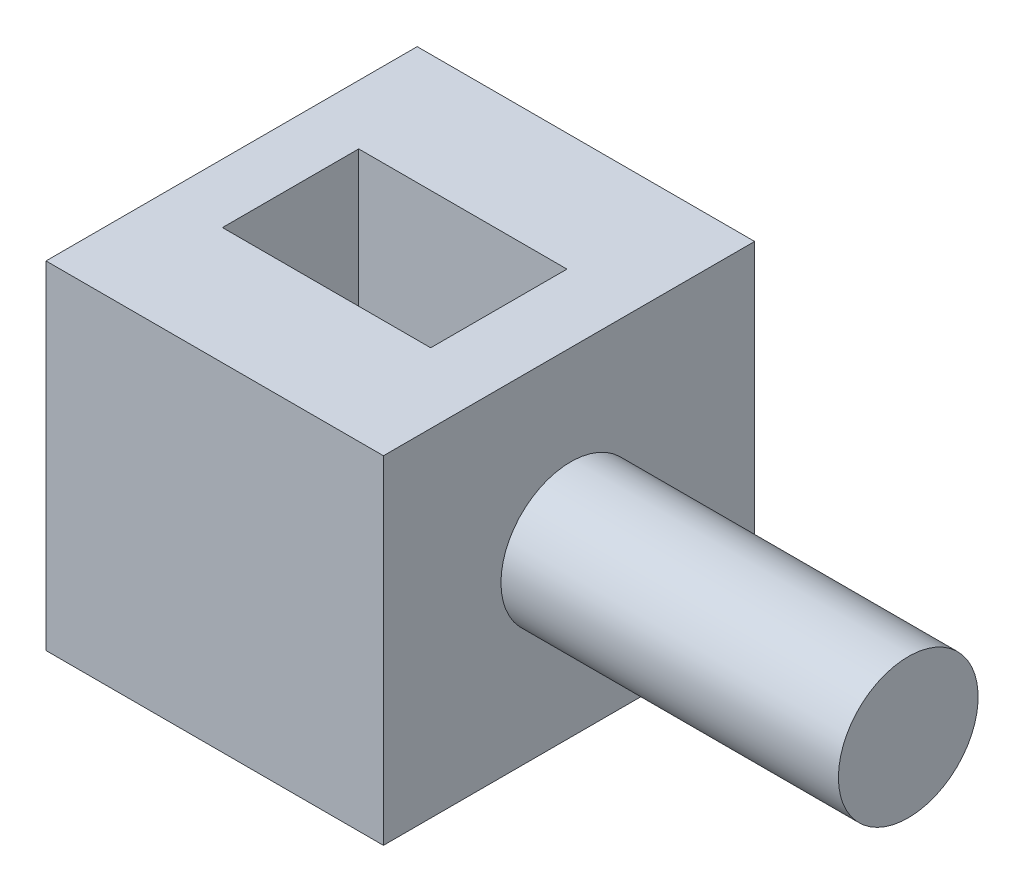
ISO-10303-21;
HEADER;
FILE_DESCRIPTION(('STEP AP214'),'2;1');
FILE_NAME('part.step','',(''),(''),'','','');
FILE_SCHEMA(('AUTOMOTIVE_DESIGN { 1 0 10303 214 1 1 1 1 }'));
ENDSEC;
DATA;
#1=APPLICATION_CONTEXT('core data for automotive mechanical design processes');
#2=APPLICATION_PROTOCOL_DEFINITION('international standard','automotive_design',2000,#1);
#3=PRODUCT_CONTEXT('',#1,'mechanical');
#4=PRODUCT('Part','Part','',(#3));
#5=PRODUCT_RELATED_PRODUCT_CATEGORY('part','',(#4));
#6=PRODUCT_DEFINITION_FORMATION('','',#4);
#7=PRODUCT_DEFINITION_CONTEXT('part definition',#1,'design');
#8=PRODUCT_DEFINITION('design','',#6,#7);
#9=PRODUCT_DEFINITION_SHAPE('','',#8);
#10=(LENGTH_UNIT() NAMED_UNIT(*) SI_UNIT(.MILLI.,.METRE.));
#11=(NAMED_UNIT(*) PLANE_ANGLE_UNIT() SI_UNIT($,.RADIAN.));
#12=(NAMED_UNIT(*) SI_UNIT($,.STERADIAN.) SOLID_ANGLE_UNIT());
#13=UNCERTAINTY_MEASURE_WITH_UNIT(LENGTH_MEASURE(1.E-05),#10,'distance_accuracy_value','');
#14=(GEOMETRIC_REPRESENTATION_CONTEXT(3) GLOBAL_UNCERTAINTY_ASSIGNED_CONTEXT((#13)) GLOBAL_UNIT_ASSIGNED_CONTEXT((#10,
#11,#12)) REPRESENTATION_CONTEXT('',''));
#15=CARTESIAN_POINT('',(0.,0.,0.));
#16=DIRECTION('',(0.,0.,1.));
#17=DIRECTION('',(1.,0.,0.));
#18=AXIS2_PLACEMENT_3D('',#15,#16,#17);
#19=CARTESIAN_POINT('',(-50.,-50.,10.));
#20=DIRECTION('',(1.,0.,0.));
#21=DIRECTION('',(0.,0.,-1.));
#22=AXIS2_PLACEMENT_3D('',#19,#20,#21);
#23=PLANE('',#22);
#24=DIRECTION('',(0.,0.,-1.));
#25=VECTOR('',#24,1.);
#26=CARTESIAN_POINT('',(-50.,50.,10.));
#27=LINE('',#26,#25);
#28=CARTESIAN_POINT('',(-50.,50.,10.));
#29=VERTEX_POINT('',#28);
#30=CARTESIAN_POINT('',(-50.,50.,-100.));
#31=VERTEX_POINT('',#30);
#32=EDGE_CURVE('E164',#29,#31,#27,.T.);
#33=ORIENTED_EDGE('',*,*,#32,.T.);
#34=DIRECTION('',(0.,-1.,0.));
#35=VECTOR('',#34,1.);
#36=CARTESIAN_POINT('',(-50.,-50.,-100.));
#37=LINE('',#36,#35);
#38=CARTESIAN_POINT('',(-50.,-50.,-100.));
#39=VERTEX_POINT('',#38);
#40=EDGE_CURVE('E142',#31,#39,#37,.T.);
#41=ORIENTED_EDGE('',*,*,#40,.T.);
#42=DIRECTION('',(0.,0.,-1.));
#43=VECTOR('',#42,1.);
#44=CARTESIAN_POINT('',(-50.,-50.,10.));
#45=LINE('',#44,#43);
#46=CARTESIAN_POINT('',(-50.,-50.,10.));
#47=VERTEX_POINT('',#46);
#48=EDGE_CURVE('E42',#47,#39,#45,.T.);
#49=ORIENTED_EDGE('',*,*,#48,.F.);
#50=DIRECTION('',(0.,-1.,0.));
#51=VECTOR('',#50,1.);
#52=CARTESIAN_POINT('',(-50.,-50.,10.));
#53=LINE('',#52,#51);
#54=EDGE_CURVE('E155',#29,#47,#53,.T.);
#55=ORIENTED_EDGE('',*,*,#54,.F.);
#56=EDGE_LOOP('',(#33,#41,#49,#55));
#57=FACE_BOUND('',#56,.T.);
#58=ADVANCED_FACE('F39',(#57),#23,.F.);
#59=CARTESIAN_POINT('',(50.,-50.,10.));
#60=DIRECTION('',(0.,1.,0.));
#61=DIRECTION('',(-1.,0.,0.));
#62=AXIS2_PLACEMENT_3D('',#59,#60,#61);
#63=PLANE('',#62);
#64=DIRECTION('',(-1.,0.,0.));
#65=VECTOR('',#64,1.);
#66=CARTESIAN_POINT('',(-32.412454573153,-50.,-65.0905983785302));
#67=LINE('',#66,#65);
#68=CARTESIAN_POINT('',(29.2943833037601,-50.,-65.0905983785302));
#69=VERTEX_POINT('',#68);
#70=CARTESIAN_POINT('',(-32.412454573153,-50.,-65.0905983785302));
#71=VERTEX_POINT('',#70);
#72=EDGE_CURVE('E112',#69,#71,#67,.T.);
#73=ORIENTED_EDGE('',*,*,#72,.T.);
#74=DIRECTION('',(0.,0.,1.));
#75=VECTOR('',#74,1.);
#76=CARTESIAN_POINT('',(-32.412454573153,-50.,-65.0905983785302));
#77=LINE('',#76,#75);
#78=CARTESIAN_POINT('',(-32.412454573153,-50.,-24.7043955155671));
#79=VERTEX_POINT('',#78);
#80=EDGE_CURVE('E106',#71,#79,#77,.T.);
#81=ORIENTED_EDGE('',*,*,#80,.T.);
#82=DIRECTION('',(1.,0.,0.));
#83=VECTOR('',#82,1.);
#84=CARTESIAN_POINT('',(-32.412454573153,-50.,-24.7043955155671));
#85=LINE('',#84,#83);
#86=CARTESIAN_POINT('',(29.2943833037601,-50.,-24.7043955155671));
#87=VERTEX_POINT('',#86);
#88=EDGE_CURVE('E115',#79,#87,#85,.T.);
#89=ORIENTED_EDGE('',*,*,#88,.T.);
#90=DIRECTION('',(0.,0.,-1.));
#91=VECTOR('',#90,1.);
#92=CARTESIAN_POINT('',(29.2943833037601,-50.,-65.0905983785302));
#93=LINE('',#92,#91);
#94=EDGE_CURVE('E54',#87,#69,#93,.T.);
#95=ORIENTED_EDGE('',*,*,#94,.T.);
#96=EDGE_LOOP('',(#73,#81,#89,#95));
#97=FACE_BOUND('',#96,.T.);
#98=ORIENTED_EDGE('',*,*,#48,.T.);
#99=DIRECTION('',(1.,0.,0.));
#100=VECTOR('',#99,1.);
#101=CARTESIAN_POINT('',(50.,-50.,-100.));
#102=LINE('',#101,#100);
#103=CARTESIAN_POINT('',(50.,-50.,-100.));
#104=VERTEX_POINT('',#103);
#105=EDGE_CURVE('E146',#39,#104,#102,.T.);
#106=ORIENTED_EDGE('',*,*,#105,.T.);
#107=DIRECTION('',(0.,0.,-1.));
#108=VECTOR('',#107,1.);
#109=CARTESIAN_POINT('',(50.,-50.,10.));
#110=LINE('',#109,#108);
#111=CARTESIAN_POINT('',(50.,-50.,10.));
#112=VERTEX_POINT('',#111);
#113=EDGE_CURVE('E167',#112,#104,#110,.T.);
#114=ORIENTED_EDGE('',*,*,#113,.F.);
#115=DIRECTION('',(1.,0.,0.));
#116=VECTOR('',#115,1.);
#117=CARTESIAN_POINT('',(50.,-50.,10.));
#118=LINE('',#117,#116);
#119=EDGE_CURVE('E158',#47,#112,#118,.T.);
#120=ORIENTED_EDGE('',*,*,#119,.F.);
#121=EDGE_LOOP('',(#98,#106,#114,#120));
#122=FACE_BOUND('',#121,.T.);
#123=ADVANCED_FACE('F119',(#97,#122),#63,.F.);
#124=CARTESIAN_POINT('',(50.,-50.,10.));
#125=DIRECTION('',(-1.,0.,0.));
#126=DIRECTION('',(0.,0.,1.));
#127=AXIS2_PLACEMENT_3D('',#124,#125,#126);
#128=PLANE('',#127);
#129=CARTESIAN_POINT('',(50.,0.,-45.5306040388087));
#130=DIRECTION('',(1.,0.,0.));
#131=DIRECTION('',(0.,0.,-1.));
#132=AXIS2_PLACEMENT_3D('',#129,#130,#131);
#133=CIRCLE('',#132,20.7046088134004);
#134=CARTESIAN_POINT('',(50.,0.,-24.8259952254084));
#135=VERTEX_POINT('',#134);
#136=EDGE_CURVE('E11',#135,#135,#133,.T.);
#137=ORIENTED_EDGE('',*,*,#136,.F.);
#138=EDGE_LOOP('',(#137));
#139=FACE_BOUND('',#138,.T.);
#140=ORIENTED_EDGE('',*,*,#113,.T.);
#141=DIRECTION('',(0.,1.,0.));
#142=VECTOR('',#141,1.);
#143=CARTESIAN_POINT('',(50.,-50.,-100.));
#144=LINE('',#143,#142);
#145=CARTESIAN_POINT('',(50.,50.,-100.));
#146=VERTEX_POINT('',#145);
#147=EDGE_CURVE('E149',#104,#146,#144,.T.);
#148=ORIENTED_EDGE('',*,*,#147,.T.);
#149=DIRECTION('',(0.,0.,-1.));
#150=VECTOR('',#149,1.);
#151=CARTESIAN_POINT('',(50.,50.,10.));
#152=LINE('',#151,#150);
#153=CARTESIAN_POINT('',(50.,50.,10.));
#154=VERTEX_POINT('',#153);
#155=EDGE_CURVE('E166',#154,#146,#152,.T.);
#156=ORIENTED_EDGE('',*,*,#155,.F.);
#157=DIRECTION('',(0.,1.,0.));
#158=VECTOR('',#157,1.);
#159=CARTESIAN_POINT('',(50.,-50.,10.));
#160=LINE('',#159,#158);
#161=EDGE_CURVE('E160',#112,#154,#160,.T.);
#162=ORIENTED_EDGE('',*,*,#161,.F.);
#163=EDGE_LOOP('',(#140,#148,#156,#162));
#164=FACE_BOUND('',#163,.T.);
#165=ADVANCED_FACE('F185',(#139,#164),#128,.F.);
#166=CARTESIAN_POINT('',(50.,50.,10.));
#167=DIRECTION('',(0.,-1.,0.));
#168=DIRECTION('',(1.,0.,0.));
#169=AXIS2_PLACEMENT_3D('',#166,#167,#168);
#170=PLANE('',#169);
#171=DIRECTION('',(1.,0.,0.));
#172=VECTOR('',#171,1.);
#173=CARTESIAN_POINT('',(-32.412454573153,50.,-24.7043955155671));
#174=LINE('',#173,#172);
#175=CARTESIAN_POINT('',(-32.412454573153,50.,-24.7043955155671));
#176=VERTEX_POINT('',#175);
#177=CARTESIAN_POINT('',(29.2943833037601,50.,-24.7043955155671));
#178=VERTEX_POINT('',#177);
#179=EDGE_CURVE('E131',#176,#178,#174,.T.);
#180=ORIENTED_EDGE('',*,*,#179,.F.);
#181=DIRECTION('',(0.,0.,1.));
#182=VECTOR('',#181,1.);
#183=CARTESIAN_POINT('',(-32.412454573153,50.,-65.0905983785302));
#184=LINE('',#183,#182);
#185=CARTESIAN_POINT('',(-32.412454573153,50.,-65.0905983785302));
#186=VERTEX_POINT('',#185);
#187=EDGE_CURVE('E62',#186,#176,#184,.T.);
#188=ORIENTED_EDGE('',*,*,#187,.F.);
#189=DIRECTION('',(-1.,0.,0.));
#190=VECTOR('',#189,1.);
#191=CARTESIAN_POINT('',(-32.412454573153,50.,-65.0905983785302));
#192=LINE('',#191,#190);
#193=CARTESIAN_POINT('',(29.2943833037601,50.,-65.0905983785302));
#194=VERTEX_POINT('',#193);
#195=EDGE_CURVE('E122',#194,#186,#192,.T.);
#196=ORIENTED_EDGE('',*,*,#195,.F.);
#197=DIRECTION('',(0.,0.,-1.));
#198=VECTOR('',#197,1.);
#199=CARTESIAN_POINT('',(29.2943833037601,50.,-65.0905983785302));
#200=LINE('',#199,#198);
#201=EDGE_CURVE('E125',#178,#194,#200,.T.);
#202=ORIENTED_EDGE('',*,*,#201,.F.);
#203=EDGE_LOOP('',(#180,#188,#196,#202));
#204=FACE_BOUND('',#203,.T.);
#205=ORIENTED_EDGE('',*,*,#155,.T.);
#206=DIRECTION('',(-1.,0.,0.));
#207=VECTOR('',#206,1.);
#208=CARTESIAN_POINT('',(50.,50.,-100.));
#209=LINE('',#208,#207);
#210=EDGE_CURVE('E152',#146,#31,#209,.T.);
#211=ORIENTED_EDGE('',*,*,#210,.T.);
#212=ORIENTED_EDGE('',*,*,#32,.F.);
#213=DIRECTION('',(-1.,0.,0.));
#214=VECTOR('',#213,1.);
#215=CARTESIAN_POINT('',(50.,50.,10.));
#216=LINE('',#215,#214);
#217=EDGE_CURVE('E162',#154,#29,#216,.T.);
#218=ORIENTED_EDGE('',*,*,#217,.F.);
#219=EDGE_LOOP('',(#205,#211,#212,#218));
#220=FACE_BOUND('',#219,.T.);
#221=ADVANCED_FACE('F183',(#204,#220),#170,.F.);
#222=CARTESIAN_POINT('',(0.,0.,10.));
#223=DIRECTION('',(0.,0.,1.));
#224=DIRECTION('',(1.,0.,0.));
#225=AXIS2_PLACEMENT_3D('',#222,#223,#224);
#226=PLANE('',#225);
#227=ORIENTED_EDGE('',*,*,#54,.T.);
#228=ORIENTED_EDGE('',*,*,#119,.T.);
#229=ORIENTED_EDGE('',*,*,#161,.T.);
#230=ORIENTED_EDGE('',*,*,#217,.T.);
#231=EDGE_LOOP('',(#227,#228,#229,#230));
#232=FACE_BOUND('',#231,.T.);
#233=ADVANCED_FACE('F194',(#232),#226,.T.);
#234=CARTESIAN_POINT('',(0.,0.,-100.));
#235=DIRECTION('',(0.,0.,1.));
#236=DIRECTION('',(1.,0.,0.));
#237=AXIS2_PLACEMENT_3D('',#234,#235,#236);
#238=PLANE('',#237);
#239=ORIENTED_EDGE('',*,*,#40,.F.);
#240=ORIENTED_EDGE('',*,*,#210,.F.);
#241=ORIENTED_EDGE('',*,*,#147,.F.);
#242=ORIENTED_EDGE('',*,*,#105,.F.);
#243=EDGE_LOOP('',(#239,#240,#241,#242));
#244=FACE_BOUND('',#243,.T.);
#245=ADVANCED_FACE('F178',(#244),#238,.F.);
#246=CARTESIAN_POINT('',(150.,0.,-45.5306040388087));
#247=DIRECTION('',(-1.,0.,0.));
#248=DIRECTION('',(0.,0.,1.));
#249=AXIS2_PLACEMENT_3D('',#246,#247,#248);
#250=CYLINDRICAL_SURFACE('',#249,20.7046088134004);
#251=CARTESIAN_POINT('',(150.,0.,-45.5306040388087));
#252=DIRECTION('',(1.,0.,0.));
#253=DIRECTION('',(0.,0.,-1.));
#254=AXIS2_PLACEMENT_3D('',#251,#252,#253);
#255=CIRCLE('',#254,20.7046088134004);
#256=CARTESIAN_POINT('',(150.,0.,-24.8259952254084));
#257=VERTEX_POINT('',#256);
#258=EDGE_CURVE('E137',#257,#257,#255,.T.);
#259=CARTESIAN_POINT('',(150.,0.,-24.8259952254084));
#260=CARTESIAN_POINT('',(148.958333333333,0.,-24.8259952254084));
#261=CARTESIAN_POINT('',(147.916666666667,0.,-24.8259952254084));
#262=CARTESIAN_POINT('',(145.833333333333,0.,-24.8259952254084));
#263=CARTESIAN_POINT('',(144.791666666667,0.,-24.8259952254084));
#264=CARTESIAN_POINT('',(142.708333333333,0.,-24.8259952254084));
#265=CARTESIAN_POINT('',(141.666666666667,0.,-24.8259952254084));
#266=CARTESIAN_POINT('',(139.583333333333,0.,-24.8259952254084));
#267=CARTESIAN_POINT('',(138.541666666667,0.,-24.8259952254084));
#268=CARTESIAN_POINT('',(136.458333333333,0.,-24.8259952254084));
#269=CARTESIAN_POINT('',(135.416666666667,0.,-24.8259952254084));
#270=CARTESIAN_POINT('',(133.333333333333,0.,-24.8259952254084));
#271=CARTESIAN_POINT('',(132.291666666667,0.,-24.8259952254084));
#272=CARTESIAN_POINT('',(130.208333333333,0.,-24.8259952254084));
#273=CARTESIAN_POINT('',(129.166666666667,0.,-24.8259952254084));
#274=CARTESIAN_POINT('',(127.083333333333,0.,-24.8259952254084));
#275=CARTESIAN_POINT('',(126.041666666667,0.,-24.8259952254084));
#276=CARTESIAN_POINT('',(123.958333333333,0.,-24.8259952254084));
#277=CARTESIAN_POINT('',(122.916666666667,0.,-24.8259952254084));
#278=CARTESIAN_POINT('',(120.833333333333,0.,-24.8259952254084));
#279=CARTESIAN_POINT('',(119.791666666667,0.,-24.8259952254084));
#280=CARTESIAN_POINT('',(117.708333333333,0.,-24.8259952254084));
#281=CARTESIAN_POINT('',(116.666666666667,0.,-24.8259952254084));
#282=CARTESIAN_POINT('',(114.583333333333,0.,-24.8259952254084));
#283=CARTESIAN_POINT('',(113.541666666667,0.,-24.8259952254084));
#284=CARTESIAN_POINT('',(111.458333333333,0.,-24.8259952254084));
#285=CARTESIAN_POINT('',(110.416666666667,0.,-24.8259952254084));
#286=CARTESIAN_POINT('',(108.333333333333,0.,-24.8259952254084));
#287=CARTESIAN_POINT('',(107.291666666667,0.,-24.8259952254084));
#288=CARTESIAN_POINT('',(105.208333333333,0.,-24.8259952254084));
#289=CARTESIAN_POINT('',(104.166666666667,0.,-24.8259952254084));
#290=CARTESIAN_POINT('',(102.083333333333,0.,-24.8259952254084));
#291=CARTESIAN_POINT('',(101.041666666667,0.,-24.8259952254084));
#292=CARTESIAN_POINT('',(98.9583333333333,0.,-24.8259952254084));
#293=CARTESIAN_POINT('',(97.9166666666667,0.,-24.8259952254084));
#294=CARTESIAN_POINT('',(95.8333333333333,0.,-24.8259952254084));
#295=CARTESIAN_POINT('',(94.7916666666667,0.,-24.8259952254084));
#296=CARTESIAN_POINT('',(92.7083333333333,0.,-24.8259952254084));
#297=CARTESIAN_POINT('',(91.6666666666667,0.,-24.8259952254084));
#298=CARTESIAN_POINT('',(89.5833333333333,0.,-24.8259952254084));
#299=CARTESIAN_POINT('',(88.5416666666667,0.,-24.8259952254084));
#300=CARTESIAN_POINT('',(86.4583333333333,0.,-24.8259952254084));
#301=CARTESIAN_POINT('',(85.4166666666667,0.,-24.8259952254084));
#302=CARTESIAN_POINT('',(83.3333333333333,0.,-24.8259952254084));
#303=CARTESIAN_POINT('',(82.2916666666667,0.,-24.8259952254084));
#304=CARTESIAN_POINT('',(80.2083333333333,0.,-24.8259952254084));
#305=CARTESIAN_POINT('',(79.1666666666667,0.,-24.8259952254084));
#306=CARTESIAN_POINT('',(77.0833333333334,0.,-24.8259952254084));
#307=CARTESIAN_POINT('',(76.0416666666667,0.,-24.8259952254084));
#308=CARTESIAN_POINT('',(73.9583333333333,0.,-24.8259952254084));
#309=CARTESIAN_POINT('',(72.9166666666667,0.,-24.8259952254084));
#310=CARTESIAN_POINT('',(70.8333333333333,0.,-24.8259952254084));
#311=CARTESIAN_POINT('',(69.7916666666667,0.,-24.8259952254084));
#312=CARTESIAN_POINT('',(67.7083333333333,0.,-24.8259952254084));
#313=CARTESIAN_POINT('',(66.6666666666667,0.,-24.8259952254084));
#314=CARTESIAN_POINT('',(64.5833333333333,0.,-24.8259952254084));
#315=CARTESIAN_POINT('',(63.5416666666667,0.,-24.8259952254084));
#316=CARTESIAN_POINT('',(61.4583333333333,0.,-24.8259952254084));
#317=CARTESIAN_POINT('',(60.4166666666667,0.,-24.8259952254084));
#318=CARTESIAN_POINT('',(58.3333333333333,0.,-24.8259952254084));
#319=CARTESIAN_POINT('',(57.2916666666667,0.,-24.8259952254084));
#320=CARTESIAN_POINT('',(55.2083333333333,0.,-24.8259952254084));
#321=CARTESIAN_POINT('',(54.1666666666667,0.,-24.8259952254084));
#322=CARTESIAN_POINT('',(52.0833333333333,0.,-24.8259952254084));
#323=CARTESIAN_POINT('',(51.0416666666667,0.,-24.8259952254084));
#324=CARTESIAN_POINT('',(50.,0.,-24.8259952254084));
#325=B_SPLINE_CURVE_WITH_KNOTS('',3,(#259,#260,#261,#262,#263,#264,#265,#266,#267,#268,#269,
#270,#271,#272,#273,#274,#275,#276,#277,#278,#279,#280,#281,#282,#283,#284,#285,#286,#287,#288,
#289,#290,#291,#292,#293,#294,#295,#296,#297,#298,#299,#300,#301,#302,#303,#304,#305,#306,#307,
#308,#309,#310,#311,#312,#313,#314,#315,#316,#317,#318,#319,#320,#321,#322,#323,#324),
.UNSPECIFIED.,.F.,.F.,(4,2,2,2,2,2,2,2,2,2,2,2,2,2,2,2,2,2,2,2,2,2,2,2,2,2,2,2,2,2,2,2,4),(0.,
3.12500000000002,6.25000000000001,9.37500000000002,12.5,15.625,18.75,21.875,25.,28.125,31.25,
34.375,37.5,40.625,43.75,46.875,50.,53.125,56.25,59.375,62.5,65.625,68.75,71.875,75.,78.125,
81.25,84.375,87.5,90.625,93.75,96.875,100.),.UNSPECIFIED.);
#326=EDGE_CURVE('BSEAM217',#257,#135,#325,.T.);
#327=ORIENTED_EDGE('',*,*,#258,.F.);
#328=ORIENTED_EDGE('',*,*,#136,.T.);
#329=ORIENTED_EDGE('',*,*,#326,.T.);
#330=ORIENTED_EDGE('',*,*,#326,.F.);
#331=EDGE_LOOP('',(#327,#329,#328,#330));
#332=FACE_BOUND('',#331,.T.);
#333=ADVANCED_FACE('F217',(#332),#250,.T.);
#334=CARTESIAN_POINT('',(150.,0.,-45.5306040388087));
#335=DIRECTION('',(1.,0.,0.));
#336=DIRECTION('',(0.,0.,-1.));
#337=AXIS2_PLACEMENT_3D('',#334,#335,#336);
#338=PLANE('',#337);
#339=ORIENTED_EDGE('',*,*,#258,.T.);
#340=EDGE_LOOP('',(#339));
#341=FACE_BOUND('',#340,.T.);
#342=ADVANCED_FACE('F228',(#341),#338,.T.);
#343=CARTESIAN_POINT('',(-32.412454573153,-50.,-65.0905983785302));
#344=DIRECTION('',(-1.,0.,0.));
#345=DIRECTION('',(0.,-1.,0.));
#346=AXIS2_PLACEMENT_3D('',#343,#344,#345);
#347=PLANE('',#346);
#348=ORIENTED_EDGE('',*,*,#187,.T.);
#349=DIRECTION('',(0.,1.,0.));
#350=VECTOR('',#349,1.);
#351=CARTESIAN_POINT('',(-32.412454573153,-50.,-24.7043955155671));
#352=LINE('',#351,#350);
#353=EDGE_CURVE('E102',#79,#176,#352,.T.);
#354=ORIENTED_EDGE('',*,*,#353,.F.);
#355=ORIENTED_EDGE('',*,*,#80,.F.);
#356=DIRECTION('',(0.,1.,0.));
#357=VECTOR('',#356,1.);
#358=CARTESIAN_POINT('',(-32.412454573153,-50.,-65.0905983785302));
#359=LINE('',#358,#357);
#360=EDGE_CURVE('E135',#71,#186,#359,.T.);
#361=ORIENTED_EDGE('',*,*,#360,.T.);
#362=EDGE_LOOP('',(#348,#354,#355,#361));
#363=FACE_BOUND('',#362,.T.);
#364=ADVANCED_FACE('F104',(#363),#347,.F.);
#365=CARTESIAN_POINT('',(-32.412454573153,-50.,-65.0905983785302));
#366=DIRECTION('',(0.,0.,-1.));
#367=DIRECTION('',(-1.,0.,0.));
#368=AXIS2_PLACEMENT_3D('',#365,#366,#367);
#369=PLANE('',#368);
#370=ORIENTED_EDGE('',*,*,#195,.T.);
#371=ORIENTED_EDGE('',*,*,#360,.F.);
#372=ORIENTED_EDGE('',*,*,#72,.F.);
#373=DIRECTION('',(0.,1.,0.));
#374=VECTOR('',#373,1.);
#375=CARTESIAN_POINT('',(29.2943833037601,-50.,-65.0905983785302));
#376=LINE('',#375,#374);
#377=EDGE_CURVE('E138',#69,#194,#376,.T.);
#378=ORIENTED_EDGE('',*,*,#377,.T.);
#379=EDGE_LOOP('',(#370,#371,#372,#378));
#380=FACE_BOUND('',#379,.T.);
#381=ADVANCED_FACE('F247',(#380),#369,.F.);
#382=CARTESIAN_POINT('',(29.2943833037601,-50.,-65.0905983785302));
#383=DIRECTION('',(1.,0.,0.));
#384=DIRECTION('',(0.,1.,0.));
#385=AXIS2_PLACEMENT_3D('',#382,#383,#384);
#386=PLANE('',#385);
#387=ORIENTED_EDGE('',*,*,#201,.T.);
#388=ORIENTED_EDGE('',*,*,#377,.F.);
#389=ORIENTED_EDGE('',*,*,#94,.F.);
#390=DIRECTION('',(0.,1.,0.));
#391=VECTOR('',#390,1.);
#392=CARTESIAN_POINT('',(29.2943833037601,-50.,-24.7043955155671));
#393=LINE('',#392,#391);
#394=EDGE_CURVE('E111',#87,#178,#393,.T.);
#395=ORIENTED_EDGE('',*,*,#394,.T.);
#396=EDGE_LOOP('',(#387,#388,#389,#395));
#397=FACE_BOUND('',#396,.T.);
#398=ADVANCED_FACE('F256',(#397),#386,.F.);
#399=CARTESIAN_POINT('',(-32.412454573153,-50.,-24.7043955155671));
#400=DIRECTION('',(0.,0.,1.));
#401=DIRECTION('',(1.,0.,0.));
#402=AXIS2_PLACEMENT_3D('',#399,#400,#401);
#403=PLANE('',#402);
#404=ORIENTED_EDGE('',*,*,#179,.T.);
#405=ORIENTED_EDGE('',*,*,#394,.F.);
#406=ORIENTED_EDGE('',*,*,#88,.F.);
#407=ORIENTED_EDGE('',*,*,#353,.T.);
#408=EDGE_LOOP('',(#404,#405,#406,#407));
#409=FACE_BOUND('',#408,.T.);
#410=ADVANCED_FACE('F116',(#409),#403,.F.);
#411=CLOSED_SHELL('',(#58,#123,#165,#221,#233,#245,#333,#342,#364,#381,#398,#410));
#412=MANIFOLD_SOLID_BREP('B2',#411);
#413=ADVANCED_BREP_SHAPE_REPRESENTATION('',(#18,#412),#14);
#414=SHAPE_DEFINITION_REPRESENTATION(#9,#413);
ENDSEC;
END-ISO-10303-21;
